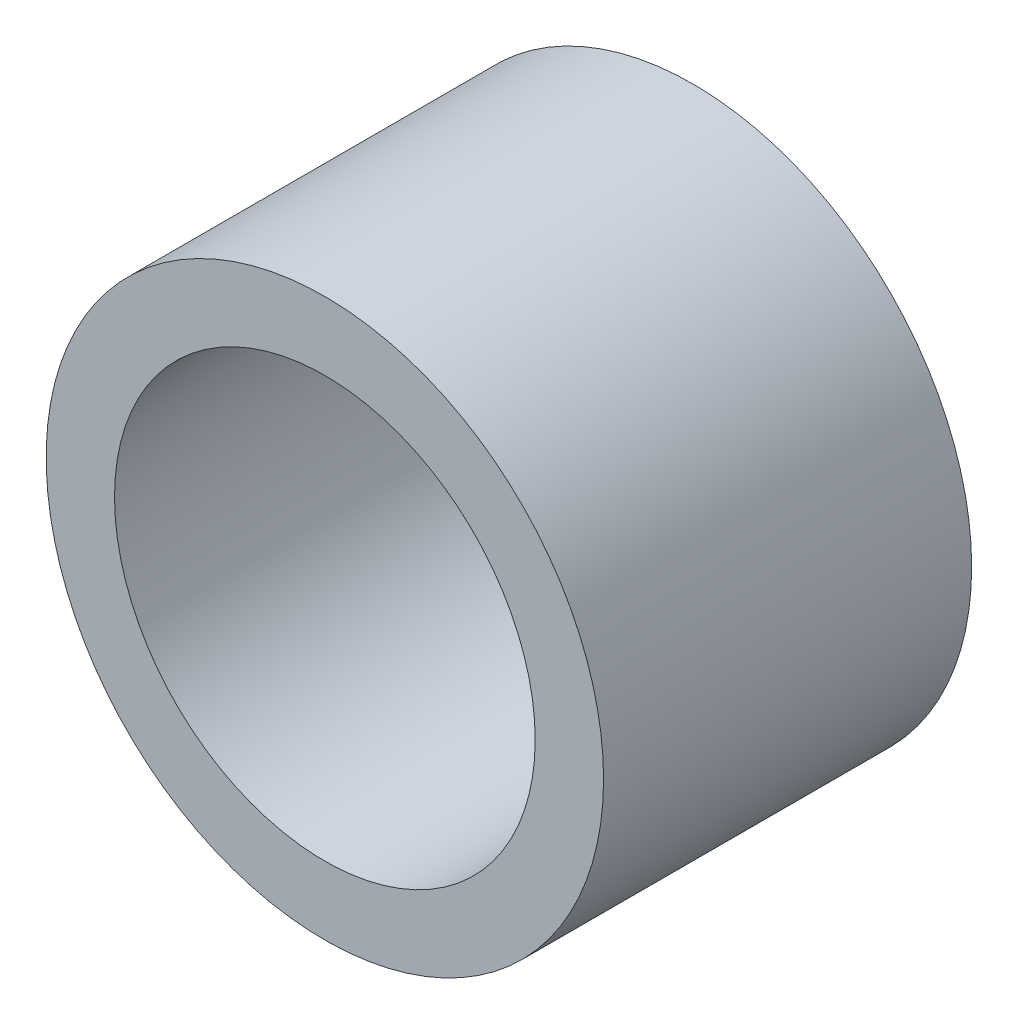
ISO-10303-21;
HEADER;
FILE_DESCRIPTION(('STEP AP214'),'2;1');
FILE_NAME('part.step','',(''),(''),'','','');
FILE_SCHEMA(('AUTOMOTIVE_DESIGN { 1 0 10303 214 1 1 1 1 }'));
ENDSEC;
DATA;
#1=APPLICATION_CONTEXT('core data for automotive mechanical design processes');
#2=APPLICATION_PROTOCOL_DEFINITION('international standard','automotive_design',2000,#1);
#3=PRODUCT_CONTEXT('',#1,'mechanical');
#4=PRODUCT('Part','Part','',(#3));
#5=PRODUCT_RELATED_PRODUCT_CATEGORY('part','',(#4));
#6=PRODUCT_DEFINITION_FORMATION('','',#4);
#7=PRODUCT_DEFINITION_CONTEXT('part definition',#1,'design');
#8=PRODUCT_DEFINITION('design','',#6,#7);
#9=PRODUCT_DEFINITION_SHAPE('','',#8);
#10=(LENGTH_UNIT() NAMED_UNIT(*) SI_UNIT(.MILLI.,.METRE.));
#11=(NAMED_UNIT(*) PLANE_ANGLE_UNIT() SI_UNIT($,.RADIAN.));
#12=(NAMED_UNIT(*) SI_UNIT($,.STERADIAN.) SOLID_ANGLE_UNIT());
#13=UNCERTAINTY_MEASURE_WITH_UNIT(LENGTH_MEASURE(1.E-05),#10,'distance_accuracy_value','');
#14=(GEOMETRIC_REPRESENTATION_CONTEXT(3) GLOBAL_UNCERTAINTY_ASSIGNED_CONTEXT((#13)) GLOBAL_UNIT_ASSIGNED_CONTEXT((#10,
#11,#12)) REPRESENTATION_CONTEXT('',''));
#15=CARTESIAN_POINT('',(0.,0.,0.));
#16=DIRECTION('',(0.,0.,1.));
#17=DIRECTION('',(1.,0.,0.));
#18=AXIS2_PLACEMENT_3D('',#15,#16,#17);
#19=CARTESIAN_POINT('',(0.,0.,7.));
#20=DIRECTION('',(0.,0.,1.));
#21=DIRECTION('',(1.,0.,0.));
#22=AXIS2_PLACEMENT_3D('',#19,#20,#21);
#23=PLANE('',#22);
#24=CARTESIAN_POINT('',(0.,0.,7.));
#25=DIRECTION('',(0.,0.,1.));
#26=DIRECTION('',(1.,0.,0.));
#27=AXIS2_PLACEMENT_3D('',#24,#25,#26);
#28=CIRCLE('',#27,5.3);
#29=CARTESIAN_POINT('',(5.3,0.,7.));
#30=VERTEX_POINT('',#29);
#31=EDGE_CURVE('E10',#30,#30,#28,.T.);
#32=ORIENTED_EDGE('',*,*,#31,.T.);
#33=EDGE_LOOP('',(#32));
#34=FACE_BOUND('',#33,.T.);
#35=CARTESIAN_POINT('',(0.,0.,7.));
#36=DIRECTION('',(0.,0.,1.));
#37=DIRECTION('',(1.,0.,0.));
#38=AXIS2_PLACEMENT_3D('',#35,#36,#37);
#39=CIRCLE('',#38,4.);
#40=CARTESIAN_POINT('',(4.,0.,7.));
#41=VERTEX_POINT('',#40);
#42=EDGE_CURVE('E50',#41,#41,#39,.T.);
#43=ORIENTED_EDGE('',*,*,#42,.F.);
#44=EDGE_LOOP('',(#43));
#45=FACE_BOUND('',#44,.T.);
#46=ADVANCED_FACE('F37',(#34,#45),#23,.T.);
#47=CARTESIAN_POINT('',(0.,0.,0.));
#48=DIRECTION('',(0.,0.,1.));
#49=DIRECTION('',(1.,0.,0.));
#50=AXIS2_PLACEMENT_3D('',#47,#48,#49);
#51=PLANE('',#50);
#52=CARTESIAN_POINT('',(0.,0.,0.));
#53=DIRECTION('',(0.,0.,1.));
#54=DIRECTION('',(1.,0.,0.));
#55=AXIS2_PLACEMENT_3D('',#52,#53,#54);
#56=CIRCLE('',#55,5.3);
#57=CARTESIAN_POINT('',(5.3,0.,0.));
#58=VERTEX_POINT('',#57);
#59=EDGE_CURVE('E41',#58,#58,#56,.T.);
#60=ORIENTED_EDGE('',*,*,#59,.F.);
#61=EDGE_LOOP('',(#60));
#62=FACE_BOUND('',#61,.T.);
#63=CARTESIAN_POINT('',(0.,0.,0.));
#64=DIRECTION('',(0.,0.,1.));
#65=DIRECTION('',(1.,0.,0.));
#66=AXIS2_PLACEMENT_3D('',#63,#64,#65);
#67=CIRCLE('',#66,4.);
#68=CARTESIAN_POINT('',(4.,0.,0.));
#69=VERTEX_POINT('',#68);
#70=EDGE_CURVE('E52',#69,#69,#67,.T.);
#71=ORIENTED_EDGE('',*,*,#70,.T.);
#72=EDGE_LOOP('',(#71));
#73=FACE_BOUND('',#72,.T.);
#74=ADVANCED_FACE('F64',(#62,#73),#51,.F.);
#75=CARTESIAN_POINT('',(0.,0.,7.));
#76=DIRECTION('',(0.,0.,-1.));
#77=DIRECTION('',(-1.,0.,0.));
#78=AXIS2_PLACEMENT_3D('',#75,#76,#77);
#79=CYLINDRICAL_SURFACE('',#78,5.3);
#80=ORIENTED_EDGE('',*,*,#31,.F.);
#81=EDGE_LOOP('',(#80));
#82=FACE_BOUND('',#81,.T.);
#83=ORIENTED_EDGE('',*,*,#59,.T.);
#84=EDGE_LOOP('',(#83));
#85=FACE_BOUND('',#84,.T.);
#86=ADVANCED_FACE('F39',(#82,#85),#79,.T.);
#87=CARTESIAN_POINT('',(0.,0.,7.));
#88=DIRECTION('',(0.,0.,-1.));
#89=DIRECTION('',(-1.,0.,0.));
#90=AXIS2_PLACEMENT_3D('',#87,#88,#89);
#91=CYLINDRICAL_SURFACE('',#90,4.);
#92=ORIENTED_EDGE('',*,*,#42,.T.);
#93=EDGE_LOOP('',(#92));
#94=FACE_BOUND('',#93,.T.);
#95=ORIENTED_EDGE('',*,*,#70,.F.);
#96=EDGE_LOOP('',(#95));
#97=FACE_BOUND('',#96,.T.);
#98=ADVANCED_FACE('F60',(#94,#97),#91,.F.);
#99=CLOSED_SHELL('',(#46,#74,#86,#98));
#100=MANIFOLD_SOLID_BREP('B2',#99);
#101=ADVANCED_BREP_SHAPE_REPRESENTATION('',(#18,#100),#14);
#102=SHAPE_DEFINITION_REPRESENTATION(#9,#101);
ENDSEC;
END-ISO-10303-21;
